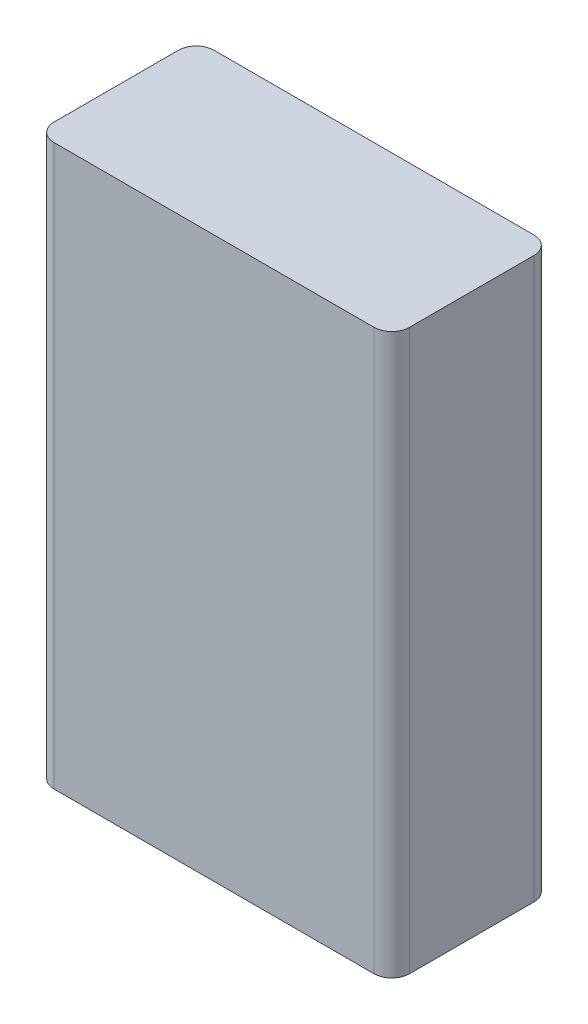
ISO-10303-21;
HEADER;
FILE_DESCRIPTION(('STEP AP214'),'2;1');
FILE_NAME('part.step','',(''),(''),'','','');
FILE_SCHEMA(('AUTOMOTIVE_DESIGN { 1 0 10303 214 1 1 1 1 }'));
ENDSEC;
DATA;
#1=APPLICATION_CONTEXT('core data for automotive mechanical design processes');
#2=APPLICATION_PROTOCOL_DEFINITION('international standard','automotive_design',2000,#1);
#3=PRODUCT_CONTEXT('',#1,'mechanical');
#4=PRODUCT('Part','Part','',(#3));
#5=PRODUCT_RELATED_PRODUCT_CATEGORY('part','',(#4));
#6=PRODUCT_DEFINITION_FORMATION('','',#4);
#7=PRODUCT_DEFINITION_CONTEXT('part definition',#1,'design');
#8=PRODUCT_DEFINITION('design','',#6,#7);
#9=PRODUCT_DEFINITION_SHAPE('','',#8);
#10=(LENGTH_UNIT() NAMED_UNIT(*) SI_UNIT(.MILLI.,.METRE.));
#11=(NAMED_UNIT(*) PLANE_ANGLE_UNIT() SI_UNIT($,.RADIAN.));
#12=(NAMED_UNIT(*) SI_UNIT($,.STERADIAN.) SOLID_ANGLE_UNIT());
#13=UNCERTAINTY_MEASURE_WITH_UNIT(LENGTH_MEASURE(1.E-05),#10,'distance_accuracy_value','');
#14=(GEOMETRIC_REPRESENTATION_CONTEXT(3) GLOBAL_UNCERTAINTY_ASSIGNED_CONTEXT((#13)) GLOBAL_UNIT_ASSIGNED_CONTEXT((#10,
#11,#12)) REPRESENTATION_CONTEXT('',''));
#15=CARTESIAN_POINT('',(0.,0.,0.));
#16=DIRECTION('',(0.,0.,1.));
#17=DIRECTION('',(1.,0.,0.));
#18=AXIS2_PLACEMENT_3D('',#15,#16,#17);
#19=CARTESIAN_POINT('',(0.,63.,18.));
#20=DIRECTION('',(1.,0.,0.));
#21=DIRECTION('',(0.,0.,-1.));
#22=AXIS2_PLACEMENT_3D('',#19,#20,#21);
#23=PLANE('',#22);
#24=DIRECTION('',(0.,0.,-1.));
#25=VECTOR('',#24,1.);
#26=CARTESIAN_POINT('',(0.,63.,18.));
#27=LINE('',#26,#25);
#28=CARTESIAN_POINT('',(0.,63.,16.));
#29=VERTEX_POINT('',#28);
#30=CARTESIAN_POINT('',(0.,63.,2.));
#31=VERTEX_POINT('',#30);
#32=EDGE_CURVE('E160',#29,#31,#27,.T.);
#33=ORIENTED_EDGE('',*,*,#32,.T.);
#34=DIRECTION('',(0.,-1.,0.));
#35=VECTOR('',#34,1.);
#36=CARTESIAN_POINT('',(0.,63.,2.));
#37=LINE('',#36,#35);
#38=CARTESIAN_POINT('',(0.,0.,2.));
#39=VERTEX_POINT('',#38);
#40=EDGE_CURVE('E124',#31,#39,#37,.T.);
#41=ORIENTED_EDGE('',*,*,#40,.T.);
#42=DIRECTION('',(0.,0.,-1.));
#43=VECTOR('',#42,1.);
#44=CARTESIAN_POINT('',(0.,0.,18.));
#45=LINE('',#44,#43);
#46=CARTESIAN_POINT('',(0.,0.,16.));
#47=VERTEX_POINT('',#46);
#48=EDGE_CURVE('E109',#47,#39,#45,.T.);
#49=ORIENTED_EDGE('',*,*,#48,.F.);
#50=DIRECTION('',(0.,-1.,0.));
#51=VECTOR('',#50,1.);
#52=CARTESIAN_POINT('',(0.,63.,16.));
#53=LINE('',#52,#51);
#54=EDGE_CURVE('E121',#47,#29,#53,.F.);
#55=ORIENTED_EDGE('',*,*,#54,.T.);
#56=EDGE_LOOP('',(#33,#41,#49,#55));
#57=FACE_BOUND('',#56,.T.);
#58=ADVANCED_FACE('F39',(#57),#23,.F.);
#59=CARTESIAN_POINT('',(0.,0.,18.));
#60=DIRECTION('',(0.,1.,0.));
#61=DIRECTION('',(0.,0.,1.));
#62=AXIS2_PLACEMENT_3D('',#59,#60,#61);
#63=PLANE('',#62);
#64=ORIENTED_EDGE('',*,*,#48,.T.);
#65=CARTESIAN_POINT('',(2.,0.,2.));
#66=DIRECTION('',(0.,1.,0.));
#67=DIRECTION('',(0.,0.,1.));
#68=AXIS2_PLACEMENT_3D('',#65,#66,#67);
#69=CIRCLE('',#68,2.);
#70=CARTESIAN_POINT('',(2.,0.,0.));
#71=VERTEX_POINT('',#70);
#72=EDGE_CURVE('E136',#39,#71,#69,.F.);
#73=ORIENTED_EDGE('',*,*,#72,.T.);
#74=DIRECTION('',(1.,0.,0.));
#75=VECTOR('',#74,1.);
#76=CARTESIAN_POINT('',(0.,0.,0.));
#77=LINE('',#76,#75);
#78=CARTESIAN_POINT('',(38.,0.,0.));
#79=VERTEX_POINT('',#78);
#80=EDGE_CURVE('E167',#71,#79,#77,.T.);
#81=ORIENTED_EDGE('',*,*,#80,.T.);
#82=CARTESIAN_POINT('',(38.,0.,2.));
#83=DIRECTION('',(0.,1.,0.));
#84=DIRECTION('',(0.,0.,1.));
#85=AXIS2_PLACEMENT_3D('',#82,#83,#84);
#86=CIRCLE('',#85,2.);
#87=CARTESIAN_POINT('',(40.,0.,2.));
#88=VERTEX_POINT('',#87);
#89=EDGE_CURVE('E115',#79,#88,#86,.F.);
#90=ORIENTED_EDGE('',*,*,#89,.T.);
#91=DIRECTION('',(0.,0.,-1.));
#92=VECTOR('',#91,1.);
#93=CARTESIAN_POINT('',(40.,0.,18.));
#94=LINE('',#93,#92);
#95=CARTESIAN_POINT('',(40.,0.,16.));
#96=VERTEX_POINT('',#95);
#97=EDGE_CURVE('E125',#96,#88,#94,.T.);
#98=ORIENTED_EDGE('',*,*,#97,.F.);
#99=CARTESIAN_POINT('',(38.,0.,16.));
#100=DIRECTION('',(0.,1.,0.));
#101=DIRECTION('',(0.,0.,1.));
#102=AXIS2_PLACEMENT_3D('',#99,#100,#101);
#103=CIRCLE('',#102,2.);
#104=CARTESIAN_POINT('',(38.,0.,18.));
#105=VERTEX_POINT('',#104);
#106=EDGE_CURVE('E116',#96,#105,#103,.F.);
#107=ORIENTED_EDGE('',*,*,#106,.T.);
#108=DIRECTION('',(1.,0.,0.));
#109=VECTOR('',#108,1.);
#110=CARTESIAN_POINT('',(0.,0.,18.));
#111=LINE('',#110,#109);
#112=CARTESIAN_POINT('',(2.,0.,18.));
#113=VERTEX_POINT('',#112);
#114=EDGE_CURVE('E111',#113,#105,#111,.T.);
#115=ORIENTED_EDGE('',*,*,#114,.F.);
#116=CARTESIAN_POINT('',(2.,0.,16.));
#117=DIRECTION('',(0.,1.,0.));
#118=DIRECTION('',(0.,0.,1.));
#119=AXIS2_PLACEMENT_3D('',#116,#117,#118);
#120=CIRCLE('',#119,2.);
#121=EDGE_CURVE('E106',#113,#47,#120,.F.);
#122=ORIENTED_EDGE('',*,*,#121,.T.);
#123=EDGE_LOOP('',(#64,#73,#81,#90,#98,#107,#115,#122));
#124=FACE_BOUND('',#123,.T.);
#125=ADVANCED_FACE('F108',(#124),#63,.F.);
#126=CARTESIAN_POINT('',(40.,0.,18.));
#127=DIRECTION('',(-1.,0.,0.));
#128=DIRECTION('',(0.,0.,1.));
#129=AXIS2_PLACEMENT_3D('',#126,#127,#128);
#130=PLANE('',#129);
#131=ORIENTED_EDGE('',*,*,#97,.T.);
#132=DIRECTION('',(0.,1.,0.));
#133=VECTOR('',#132,1.);
#134=CARTESIAN_POINT('',(40.,0.,2.));
#135=LINE('',#134,#133);
#136=CARTESIAN_POINT('',(40.,63.,2.));
#137=VERTEX_POINT('',#136);
#138=EDGE_CURVE('E149',#88,#137,#135,.T.);
#139=ORIENTED_EDGE('',*,*,#138,.T.);
#140=DIRECTION('',(0.,0.,-1.));
#141=VECTOR('',#140,1.);
#142=CARTESIAN_POINT('',(40.,63.,18.));
#143=LINE('',#142,#141);
#144=CARTESIAN_POINT('',(40.,63.,16.));
#145=VERTEX_POINT('',#144);
#146=EDGE_CURVE('E162',#145,#137,#143,.T.);
#147=ORIENTED_EDGE('',*,*,#146,.F.);
#148=DIRECTION('',(0.,1.,0.));
#149=VECTOR('',#148,1.);
#150=CARTESIAN_POINT('',(40.,0.,16.));
#151=LINE('',#150,#149);
#152=EDGE_CURVE('E147',#145,#96,#151,.F.);
#153=ORIENTED_EDGE('',*,*,#152,.T.);
#154=EDGE_LOOP('',(#131,#139,#147,#153));
#155=FACE_BOUND('',#154,.T.);
#156=ADVANCED_FACE('F174',(#155),#130,.F.);
#157=CARTESIAN_POINT('',(40.,63.,18.));
#158=DIRECTION('',(0.,-1.,0.));
#159=DIRECTION('',(0.,0.,-1.));
#160=AXIS2_PLACEMENT_3D('',#157,#158,#159);
#161=PLANE('',#160);
#162=DIRECTION('',(-1.,0.,0.));
#163=VECTOR('',#162,1.);
#164=CARTESIAN_POINT('',(40.,63.,0.));
#165=LINE('',#164,#163);
#166=CARTESIAN_POINT('',(38.,63.,0.));
#167=VERTEX_POINT('',#166);
#168=CARTESIAN_POINT('',(2.,63.,0.));
#169=VERTEX_POINT('',#168);
#170=EDGE_CURVE('E164',#167,#169,#165,.T.);
#171=ORIENTED_EDGE('',*,*,#170,.T.);
#172=CARTESIAN_POINT('',(2.,63.,2.));
#173=DIRECTION('',(0.,-1.,0.));
#174=DIRECTION('',(0.,0.,-1.));
#175=AXIS2_PLACEMENT_3D('',#172,#173,#174);
#176=CIRCLE('',#175,2.);
#177=EDGE_CURVE('E145',#169,#31,#176,.F.);
#178=ORIENTED_EDGE('',*,*,#177,.T.);
#179=ORIENTED_EDGE('',*,*,#32,.F.);
#180=CARTESIAN_POINT('',(2.,63.,16.));
#181=DIRECTION('',(0.,-1.,0.));
#182=DIRECTION('',(0.,0.,-1.));
#183=AXIS2_PLACEMENT_3D('',#180,#181,#182);
#184=CIRCLE('',#183,2.);
#185=CARTESIAN_POINT('',(2.,63.,18.));
#186=VERTEX_POINT('',#185);
#187=EDGE_CURVE('E129',#29,#186,#184,.F.);
#188=ORIENTED_EDGE('',*,*,#187,.T.);
#189=DIRECTION('',(-1.,0.,0.));
#190=VECTOR('',#189,1.);
#191=CARTESIAN_POINT('',(40.,63.,18.));
#192=LINE('',#191,#190);
#193=CARTESIAN_POINT('',(38.,63.,18.));
#194=VERTEX_POINT('',#193);
#195=EDGE_CURVE('E155',#194,#186,#192,.T.);
#196=ORIENTED_EDGE('',*,*,#195,.F.);
#197=CARTESIAN_POINT('',(38.,63.,16.));
#198=DIRECTION('',(0.,-1.,0.));
#199=DIRECTION('',(0.,0.,-1.));
#200=AXIS2_PLACEMENT_3D('',#197,#198,#199);
#201=CIRCLE('',#200,2.);
#202=EDGE_CURVE('E62',#194,#145,#201,.F.);
#203=ORIENTED_EDGE('',*,*,#202,.T.);
#204=ORIENTED_EDGE('',*,*,#146,.T.);
#205=CARTESIAN_POINT('',(38.,63.,2.));
#206=DIRECTION('',(0.,-1.,0.));
#207=DIRECTION('',(0.,0.,-1.));
#208=AXIS2_PLACEMENT_3D('',#205,#206,#207);
#209=CIRCLE('',#208,2.);
#210=EDGE_CURVE('E54',#137,#167,#209,.F.);
#211=ORIENTED_EDGE('',*,*,#210,.T.);
#212=EDGE_LOOP('',(#171,#178,#179,#188,#196,#203,#204,#211));
#213=FACE_BOUND('',#212,.T.);
#214=ADVANCED_FACE('F159',(#213),#161,.F.);
#215=CARTESIAN_POINT('',(0.,0.,18.));
#216=DIRECTION('',(0.,0.,1.));
#217=DIRECTION('',(1.,0.,0.));
#218=AXIS2_PLACEMENT_3D('',#215,#216,#217);
#219=PLANE('',#218);
#220=ORIENTED_EDGE('',*,*,#195,.T.);
#221=DIRECTION('',(0.,-1.,0.));
#222=VECTOR('',#221,1.);
#223=CARTESIAN_POINT('',(2.,0.,18.));
#224=LINE('',#223,#222);
#225=EDGE_CURVE('E11',#186,#113,#224,.T.);
#226=ORIENTED_EDGE('',*,*,#225,.T.);
#227=ORIENTED_EDGE('',*,*,#114,.T.);
#228=DIRECTION('',(0.,1.,0.));
#229=VECTOR('',#228,1.);
#230=CARTESIAN_POINT('',(38.,63.,18.));
#231=LINE('',#230,#229);
#232=EDGE_CURVE('E47',#105,#194,#231,.T.);
#233=ORIENTED_EDGE('',*,*,#232,.T.);
#234=EDGE_LOOP('',(#220,#226,#227,#233));
#235=FACE_BOUND('',#234,.T.);
#236=ADVANCED_FACE('F154',(#235),#219,.T.);
#237=CARTESIAN_POINT('',(0.,0.,0.));
#238=DIRECTION('',(0.,0.,1.));
#239=DIRECTION('',(1.,0.,0.));
#240=AXIS2_PLACEMENT_3D('',#237,#238,#239);
#241=PLANE('',#240);
#242=ORIENTED_EDGE('',*,*,#80,.F.);
#243=DIRECTION('',(0.,-1.,0.));
#244=VECTOR('',#243,1.);
#245=CARTESIAN_POINT('',(2.,0.,0.));
#246=LINE('',#245,#244);
#247=EDGE_CURVE('E140',#71,#169,#246,.F.);
#248=ORIENTED_EDGE('',*,*,#247,.T.);
#249=ORIENTED_EDGE('',*,*,#170,.F.);
#250=DIRECTION('',(0.,1.,0.));
#251=VECTOR('',#250,1.);
#252=CARTESIAN_POINT('',(38.,0.,0.));
#253=LINE('',#252,#251);
#254=EDGE_CURVE('E138',#167,#79,#253,.F.);
#255=ORIENTED_EDGE('',*,*,#254,.T.);
#256=EDGE_LOOP('',(#242,#248,#249,#255));
#257=FACE_BOUND('',#256,.T.);
#258=ADVANCED_FACE('F181',(#257),#241,.F.);
#259=CARTESIAN_POINT('',(2.,63.,2.));
#260=DIRECTION('',(0.,-1.,0.));
#261=DIRECTION('',(0.,0.,-1.));
#262=AXIS2_PLACEMENT_3D('',#259,#260,#261);
#263=CYLINDRICAL_SURFACE('',#262,2.);
#264=ORIENTED_EDGE('',*,*,#177,.F.);
#265=ORIENTED_EDGE('',*,*,#247,.F.);
#266=ORIENTED_EDGE('',*,*,#72,.F.);
#267=ORIENTED_EDGE('',*,*,#40,.F.);
#268=EDGE_LOOP('',(#264,#265,#266,#267));
#269=FACE_BOUND('',#268,.T.);
#270=ADVANCED_FACE('F185',(#269),#263,.T.);
#271=CARTESIAN_POINT('',(38.,0.,2.));
#272=DIRECTION('',(0.,1.,0.));
#273=DIRECTION('',(0.,0.,1.));
#274=AXIS2_PLACEMENT_3D('',#271,#272,#273);
#275=CYLINDRICAL_SURFACE('',#274,2.);
#276=ORIENTED_EDGE('',*,*,#89,.F.);
#277=ORIENTED_EDGE('',*,*,#254,.F.);
#278=ORIENTED_EDGE('',*,*,#210,.F.);
#279=ORIENTED_EDGE('',*,*,#138,.F.);
#280=EDGE_LOOP('',(#276,#277,#278,#279));
#281=FACE_BOUND('',#280,.T.);
#282=ADVANCED_FACE('F177',(#281),#275,.T.);
#283=CARTESIAN_POINT('',(2.,0.,16.));
#284=DIRECTION('',(0.,1.,0.));
#285=DIRECTION('',(0.,0.,1.));
#286=AXIS2_PLACEMENT_3D('',#283,#284,#285);
#287=CYLINDRICAL_SURFACE('',#286,2.);
#288=ORIENTED_EDGE('',*,*,#187,.F.);
#289=ORIENTED_EDGE('',*,*,#54,.F.);
#290=ORIENTED_EDGE('',*,*,#121,.F.);
#291=ORIENTED_EDGE('',*,*,#225,.F.);
#292=EDGE_LOOP('',(#288,#289,#290,#291));
#293=FACE_BOUND('',#292,.T.);
#294=ADVANCED_FACE('F128',(#293),#287,.T.);
#295=CARTESIAN_POINT('',(38.,0.,16.));
#296=DIRECTION('',(0.,-1.,0.));
#297=DIRECTION('',(0.,0.,-1.));
#298=AXIS2_PLACEMENT_3D('',#295,#296,#297);
#299=CYLINDRICAL_SURFACE('',#298,2.);
#300=ORIENTED_EDGE('',*,*,#106,.F.);
#301=ORIENTED_EDGE('',*,*,#152,.F.);
#302=ORIENTED_EDGE('',*,*,#202,.F.);
#303=ORIENTED_EDGE('',*,*,#232,.F.);
#304=EDGE_LOOP('',(#300,#301,#302,#303));
#305=FACE_BOUND('',#304,.T.);
#306=ADVANCED_FACE('F41',(#305),#299,.T.);
#307=CLOSED_SHELL('',(#58,#125,#156,#214,#236,#258,#270,#282,#294,#306));
#308=MANIFOLD_SOLID_BREP('B2',#307);
#309=ADVANCED_BREP_SHAPE_REPRESENTATION('',(#18,#308),#14);
#310=SHAPE_DEFINITION_REPRESENTATION(#9,#309);
ENDSEC;
END-ISO-10303-21;
